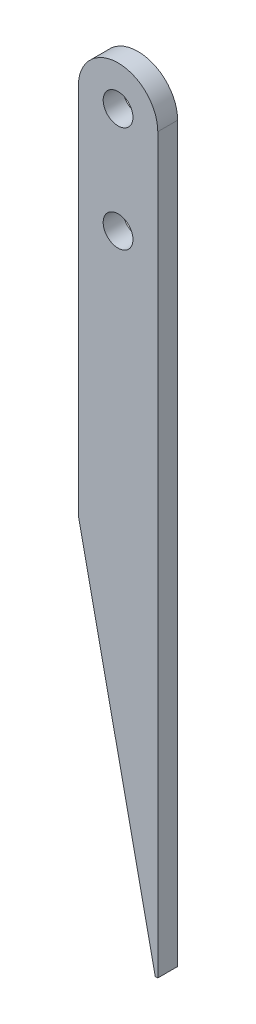
ISO-10303-21;
HEADER;
FILE_DESCRIPTION(('STEP AP214'),'2;1');
FILE_NAME('part.step','',(''),(''),'','','');
FILE_SCHEMA(('AUTOMOTIVE_DESIGN { 1 0 10303 214 1 1 1 1 }'));
ENDSEC;
DATA;
#1=APPLICATION_CONTEXT('core data for automotive mechanical design processes');
#2=APPLICATION_PROTOCOL_DEFINITION('international standard','automotive_design',2000,#1);
#3=PRODUCT_CONTEXT('',#1,'mechanical');
#4=PRODUCT('Part','Part','',(#3));
#5=PRODUCT_RELATED_PRODUCT_CATEGORY('part','',(#4));
#6=PRODUCT_DEFINITION_FORMATION('','',#4);
#7=PRODUCT_DEFINITION_CONTEXT('part definition',#1,'design');
#8=PRODUCT_DEFINITION('design','',#6,#7);
#9=PRODUCT_DEFINITION_SHAPE('','',#8);
#10=(LENGTH_UNIT() NAMED_UNIT(*) SI_UNIT(.MILLI.,.METRE.));
#11=(NAMED_UNIT(*) PLANE_ANGLE_UNIT() SI_UNIT($,.RADIAN.));
#12=(NAMED_UNIT(*) SI_UNIT($,.STERADIAN.) SOLID_ANGLE_UNIT());
#13=UNCERTAINTY_MEASURE_WITH_UNIT(LENGTH_MEASURE(1.E-05),#10,'distance_accuracy_value','');
#14=(GEOMETRIC_REPRESENTATION_CONTEXT(3) GLOBAL_UNCERTAINTY_ASSIGNED_CONTEXT((#13)) GLOBAL_UNIT_ASSIGNED_CONTEXT((#10,
#11,#12)) REPRESENTATION_CONTEXT('',''));
#15=CARTESIAN_POINT('',(0.,0.,0.));
#16=DIRECTION('',(0.,0.,1.));
#17=DIRECTION('',(1.,0.,0.));
#18=AXIS2_PLACEMENT_3D('',#15,#16,#17);
#19=CARTESIAN_POINT('',(0.,0.,2.));
#20=DIRECTION('',(0.,0.,1.));
#21=DIRECTION('',(1.,0.,0.));
#22=AXIS2_PLACEMENT_3D('',#19,#20,#21);
#23=PLANE('',#22);
#24=DIRECTION('',(-1.,0.,0.));
#25=VECTOR('',#24,1.);
#26=CARTESIAN_POINT('',(4.00000000000001,-73.8180258179935,2.));
#27=LINE('',#26,#25);
#28=CARTESIAN_POINT('',(4.00000000000001,-73.8180258179935,2.));
#29=VERTEX_POINT('',#28);
#30=CARTESIAN_POINT('',(3.74784550783863,-73.8180258179935,2.));
#31=VERTEX_POINT('',#30);
#32=EDGE_CURVE('E89',#29,#31,#27,.T.);
#33=ORIENTED_EDGE('',*,*,#32,.F.);
#34=DIRECTION('',(0.,1.,0.));
#35=VECTOR('',#34,1.);
#36=CARTESIAN_POINT('',(4.,0.,2.));
#37=LINE('',#36,#35);
#38=CARTESIAN_POINT('',(4.,0.,2.));
#39=VERTEX_POINT('',#38);
#40=EDGE_CURVE('E57',#29,#39,#37,.T.);
#41=ORIENTED_EDGE('',*,*,#40,.T.);
#42=CARTESIAN_POINT('',(0.,0.,2.));
#43=DIRECTION('',(0.,0.,1.));
#44=DIRECTION('',(1.,0.,0.));
#45=AXIS2_PLACEMENT_3D('',#42,#43,#44);
#46=CIRCLE('',#45,4.);
#47=CARTESIAN_POINT('',(-4.,0.,2.));
#48=VERTEX_POINT('',#47);
#49=EDGE_CURVE('E108',#39,#48,#46,.T.);
#50=ORIENTED_EDGE('',*,*,#49,.T.);
#51=DIRECTION('',(0.,-1.,0.));
#52=VECTOR('',#51,1.);
#53=CARTESIAN_POINT('',(-4.,-37.5,2.));
#54=LINE('',#53,#52);
#55=CARTESIAN_POINT('',(-4.,-37.5,2.));
#56=VERTEX_POINT('',#55);
#57=EDGE_CURVE('E79',#48,#56,#54,.T.);
#58=ORIENTED_EDGE('',*,*,#57,.T.);
#59=DIRECTION('',(0.208638471770519,-0.977992836424308,0.));
#60=VECTOR('',#59,1.);
#61=CARTESIAN_POINT('',(4.00000000000001,-75.,2.));
#62=LINE('',#61,#60);
#63=EDGE_CURVE('E118',#56,#31,#62,.T.);
#64=ORIENTED_EDGE('',*,*,#63,.T.);
#65=EDGE_LOOP('',(#33,#41,#50,#58,#64));
#66=FACE_BOUND('',#65,.T.);
#67=CARTESIAN_POINT('',(0.,0.,2.));
#68=DIRECTION('',(0.,0.,1.));
#69=DIRECTION('',(1.,0.,0.));
#70=AXIS2_PLACEMENT_3D('',#67,#68,#69);
#71=CIRCLE('',#70,1.5);
#72=CARTESIAN_POINT('',(1.5,0.,2.));
#73=VERTEX_POINT('',#72);
#74=EDGE_CURVE('E122',#73,#73,#71,.T.);
#75=ORIENTED_EDGE('',*,*,#74,.F.);
#76=EDGE_LOOP('',(#75));
#77=FACE_BOUND('',#76,.T.);
#78=CARTESIAN_POINT('',(0.,-10.66,2.));
#79=DIRECTION('',(0.,0.,1.));
#80=DIRECTION('',(1.,0.,0.));
#81=AXIS2_PLACEMENT_3D('',#78,#79,#80);
#82=CIRCLE('',#81,1.5);
#83=CARTESIAN_POINT('',(1.5,-10.66,2.));
#84=VERTEX_POINT('',#83);
#85=EDGE_CURVE('E130',#84,#84,#82,.T.);
#86=ORIENTED_EDGE('',*,*,#85,.F.);
#87=EDGE_LOOP('',(#86));
#88=FACE_BOUND('',#87,.T.);
#89=ADVANCED_FACE('F33',(#66,#77,#88),#23,.T.);
#90=CARTESIAN_POINT('',(0.,0.,0.));
#91=DIRECTION('',(0.,0.,1.));
#92=DIRECTION('',(1.,0.,0.));
#93=AXIS2_PLACEMENT_3D('',#90,#91,#92);
#94=PLANE('',#93);
#95=DIRECTION('',(0.,1.,0.));
#96=VECTOR('',#95,1.);
#97=CARTESIAN_POINT('',(4.,0.,0.));
#98=LINE('',#97,#96);
#99=CARTESIAN_POINT('',(4.00000000000001,-73.8180258179935,0.));
#100=VERTEX_POINT('',#99);
#101=CARTESIAN_POINT('',(4.,0.,0.));
#102=VERTEX_POINT('',#101);
#103=EDGE_CURVE('E74',#100,#102,#98,.T.);
#104=ORIENTED_EDGE('',*,*,#103,.F.);
#105=DIRECTION('',(-1.,0.,0.));
#106=VECTOR('',#105,1.);
#107=CARTESIAN_POINT('',(4.00000000000001,-73.8180258179935,0.));
#108=LINE('',#107,#106);
#109=CARTESIAN_POINT('',(3.74784550783863,-73.8180258179935,0.));
#110=VERTEX_POINT('',#109);
#111=EDGE_CURVE('E48',#100,#110,#108,.T.);
#112=ORIENTED_EDGE('',*,*,#111,.T.);
#113=DIRECTION('',(0.208638471770519,-0.977992836424308,0.));
#114=VECTOR('',#113,1.);
#115=CARTESIAN_POINT('',(4.00000000000001,-75.,0.));
#116=LINE('',#115,#114);
#117=CARTESIAN_POINT('',(-4.,-37.5,0.));
#118=VERTEX_POINT('',#117);
#119=EDGE_CURVE('E101',#118,#110,#116,.T.);
#120=ORIENTED_EDGE('',*,*,#119,.F.);
#121=DIRECTION('',(0.,-1.,0.));
#122=VECTOR('',#121,1.);
#123=CARTESIAN_POINT('',(-4.,-37.5,0.));
#124=LINE('',#123,#122);
#125=CARTESIAN_POINT('',(-4.,0.,0.));
#126=VERTEX_POINT('',#125);
#127=EDGE_CURVE('E106',#126,#118,#124,.T.);
#128=ORIENTED_EDGE('',*,*,#127,.F.);
#129=CARTESIAN_POINT('',(0.,0.,0.));
#130=DIRECTION('',(0.,0.,1.));
#131=DIRECTION('',(1.,0.,0.));
#132=AXIS2_PLACEMENT_3D('',#129,#130,#131);
#133=CIRCLE('',#132,4.);
#134=EDGE_CURVE('E110',#102,#126,#133,.T.);
#135=ORIENTED_EDGE('',*,*,#134,.F.);
#136=EDGE_LOOP('',(#104,#112,#120,#128,#135));
#137=FACE_BOUND('',#136,.T.);
#138=CARTESIAN_POINT('',(0.,0.,0.));
#139=DIRECTION('',(0.,0.,1.));
#140=DIRECTION('',(1.,0.,0.));
#141=AXIS2_PLACEMENT_3D('',#138,#139,#140);
#142=CIRCLE('',#141,1.5);
#143=CARTESIAN_POINT('',(1.5,0.,0.));
#144=VERTEX_POINT('',#143);
#145=EDGE_CURVE('E125',#144,#144,#142,.T.);
#146=ORIENTED_EDGE('',*,*,#145,.T.);
#147=EDGE_LOOP('',(#146));
#148=FACE_BOUND('',#147,.T.);
#149=CARTESIAN_POINT('',(0.,-10.66,0.));
#150=DIRECTION('',(0.,0.,1.));
#151=DIRECTION('',(1.,0.,0.));
#152=AXIS2_PLACEMENT_3D('',#149,#150,#151);
#153=CIRCLE('',#152,1.5);
#154=CARTESIAN_POINT('',(1.5,-10.66,0.));
#155=VERTEX_POINT('',#154);
#156=EDGE_CURVE('E94',#155,#155,#153,.T.);
#157=ORIENTED_EDGE('',*,*,#156,.T.);
#158=EDGE_LOOP('',(#157));
#159=FACE_BOUND('',#158,.T.);
#160=ADVANCED_FACE('F99',(#137,#148,#159),#94,.F.);
#161=CARTESIAN_POINT('',(0.,0.,2.));
#162=DIRECTION('',(0.,0.,-1.));
#163=DIRECTION('',(-1.,0.,0.));
#164=AXIS2_PLACEMENT_3D('',#161,#162,#163);
#165=CYLINDRICAL_SURFACE('',#164,4.);
#166=ORIENTED_EDGE('',*,*,#134,.T.);
#167=DIRECTION('',(0.,0.,-1.));
#168=VECTOR('',#167,1.);
#169=CARTESIAN_POINT('',(-4.,0.,2.));
#170=LINE('',#169,#168);
#171=EDGE_CURVE('E11',#48,#126,#170,.T.);
#172=ORIENTED_EDGE('',*,*,#171,.F.);
#173=ORIENTED_EDGE('',*,*,#49,.F.);
#174=DIRECTION('',(0.,0.,-1.));
#175=VECTOR('',#174,1.);
#176=CARTESIAN_POINT('',(4.,0.,2.));
#177=LINE('',#176,#175);
#178=EDGE_CURVE('E114',#39,#102,#177,.T.);
#179=ORIENTED_EDGE('',*,*,#178,.T.);
#180=EDGE_LOOP('',(#166,#172,#173,#179));
#181=FACE_BOUND('',#180,.T.);
#182=ADVANCED_FACE('F35',(#181),#165,.T.);
#183=CARTESIAN_POINT('',(-4.,-37.5,2.));
#184=DIRECTION('',(1.,0.,0.));
#185=DIRECTION('',(0.,0.,-1.));
#186=AXIS2_PLACEMENT_3D('',#183,#184,#185);
#187=PLANE('',#186);
#188=ORIENTED_EDGE('',*,*,#127,.T.);
#189=DIRECTION('',(0.,0.,-1.));
#190=VECTOR('',#189,1.);
#191=CARTESIAN_POINT('',(-4.,-37.5,2.));
#192=LINE('',#191,#190);
#193=EDGE_CURVE('E41',#56,#118,#192,.T.);
#194=ORIENTED_EDGE('',*,*,#193,.F.);
#195=ORIENTED_EDGE('',*,*,#57,.F.);
#196=ORIENTED_EDGE('',*,*,#171,.T.);
#197=EDGE_LOOP('',(#188,#194,#195,#196));
#198=FACE_BOUND('',#197,.T.);
#199=ADVANCED_FACE('F136',(#198),#187,.F.);
#200=CARTESIAN_POINT('',(4.00000000000001,-75.,2.));
#201=DIRECTION('',(0.977992836424308,0.208638471770519,0.));
#202=DIRECTION('',(-0.208638471770519,0.977992836424308,0.));
#203=AXIS2_PLACEMENT_3D('',#200,#201,#202);
#204=PLANE('',#203);
#205=ORIENTED_EDGE('',*,*,#119,.T.);
#206=DIRECTION('',(0.,0.,1.));
#207=VECTOR('',#206,1.);
#208=CARTESIAN_POINT('',(3.74784550783863,-73.8180258179935,0.));
#209=LINE('',#208,#207);
#210=EDGE_CURVE('E87',#110,#31,#209,.T.);
#211=ORIENTED_EDGE('',*,*,#210,.T.);
#212=ORIENTED_EDGE('',*,*,#63,.F.);
#213=ORIENTED_EDGE('',*,*,#193,.T.);
#214=EDGE_LOOP('',(#205,#211,#212,#213));
#215=FACE_BOUND('',#214,.T.);
#216=ADVANCED_FACE('F105',(#215),#204,.F.);
#217=CARTESIAN_POINT('',(4.,0.,2.));
#218=DIRECTION('',(-1.,0.,0.));
#219=DIRECTION('',(0.,-1.,0.));
#220=AXIS2_PLACEMENT_3D('',#217,#218,#219);
#221=PLANE('',#220);
#222=ORIENTED_EDGE('',*,*,#40,.F.);
#223=DIRECTION('',(0.,0.,1.));
#224=VECTOR('',#223,1.);
#225=CARTESIAN_POINT('',(4.00000000000001,-73.8180258179935,0.));
#226=LINE('',#225,#224);
#227=EDGE_CURVE('E95',#100,#29,#226,.T.);
#228=ORIENTED_EDGE('',*,*,#227,.F.);
#229=ORIENTED_EDGE('',*,*,#103,.T.);
#230=ORIENTED_EDGE('',*,*,#178,.F.);
#231=EDGE_LOOP('',(#222,#228,#229,#230));
#232=FACE_BOUND('',#231,.T.);
#233=ADVANCED_FACE('F153',(#232),#221,.F.);
#234=CARTESIAN_POINT('',(0.,0.,2.));
#235=DIRECTION('',(0.,0.,-1.));
#236=DIRECTION('',(-1.,0.,0.));
#237=AXIS2_PLACEMENT_3D('',#234,#235,#236);
#238=CYLINDRICAL_SURFACE('',#237,1.5);
#239=ORIENTED_EDGE('',*,*,#74,.T.);
#240=EDGE_LOOP('',(#239));
#241=FACE_BOUND('',#240,.T.);
#242=ORIENTED_EDGE('',*,*,#145,.F.);
#243=EDGE_LOOP('',(#242));
#244=FACE_BOUND('',#243,.T.);
#245=ADVANCED_FACE('F150',(#241,#244),#238,.F.);
#246=CARTESIAN_POINT('',(0.,-10.66,2.));
#247=DIRECTION('',(0.,0.,-1.));
#248=DIRECTION('',(-1.,0.,0.));
#249=AXIS2_PLACEMENT_3D('',#246,#247,#248);
#250=CYLINDRICAL_SURFACE('',#249,1.5);
#251=ORIENTED_EDGE('',*,*,#85,.T.);
#252=EDGE_LOOP('',(#251));
#253=FACE_BOUND('',#252,.T.);
#254=ORIENTED_EDGE('',*,*,#156,.F.);
#255=EDGE_LOOP('',(#254));
#256=FACE_BOUND('',#255,.T.);
#257=ADVANCED_FACE('F171',(#253,#256),#250,.F.);
#258=CARTESIAN_POINT('',(4.00000000000001,-73.8180258179935,0.));
#259=DIRECTION('',(0.,1.,0.));
#260=DIRECTION('',(0.,0.,1.));
#261=AXIS2_PLACEMENT_3D('',#258,#259,#260);
#262=PLANE('',#261);
#263=ORIENTED_EDGE('',*,*,#32,.T.);
#264=ORIENTED_EDGE('',*,*,#210,.F.);
#265=ORIENTED_EDGE('',*,*,#111,.F.);
#266=ORIENTED_EDGE('',*,*,#227,.T.);
#267=EDGE_LOOP('',(#263,#264,#265,#266));
#268=FACE_BOUND('',#267,.T.);
#269=ADVANCED_FACE('F88',(#268),#262,.F.);
#270=CLOSED_SHELL('',(#89,#160,#182,#199,#216,#233,#245,#257,#269));
#271=MANIFOLD_SOLID_BREP('B2',#270);
#272=ADVANCED_BREP_SHAPE_REPRESENTATION('',(#18,#271),#14);
#273=SHAPE_DEFINITION_REPRESENTATION(#9,#272);
ENDSEC;
END-ISO-10303-21;
